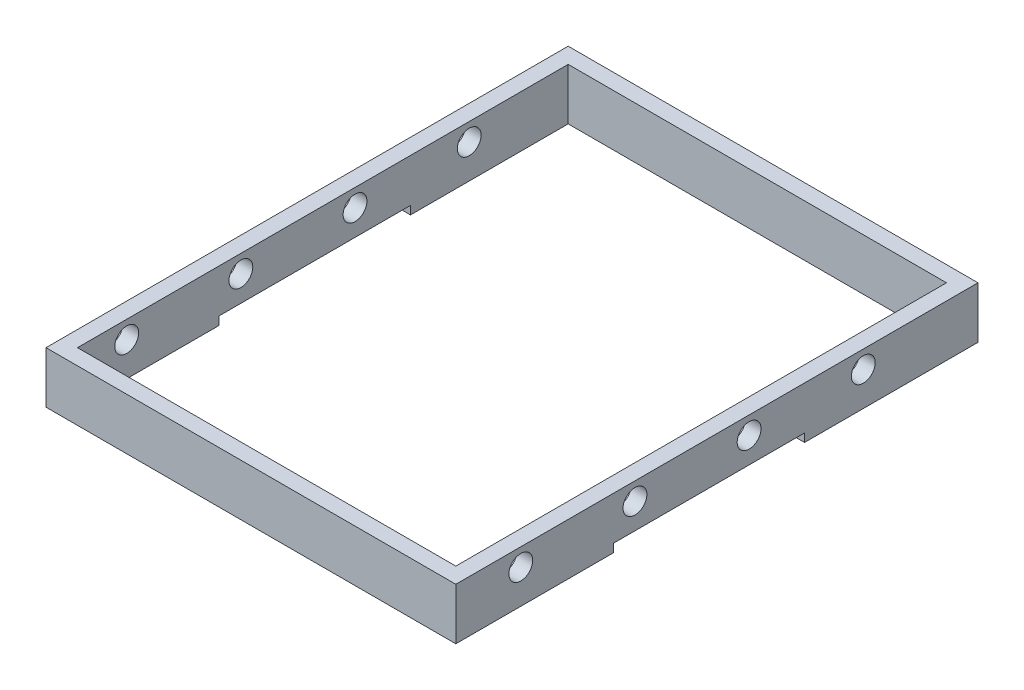
ISO-10303-21;
HEADER;
FILE_DESCRIPTION(('STEP AP214'),'2;1');
FILE_NAME('part.step','',(''),(''),'','','');
FILE_SCHEMA(('AUTOMOTIVE_DESIGN { 1 0 10303 214 1 1 1 1 }'));
ENDSEC;
DATA;
#1=APPLICATION_CONTEXT('core data for automotive mechanical design processes');
#2=APPLICATION_PROTOCOL_DEFINITION('international standard','automotive_design',2000,#1);
#3=PRODUCT_CONTEXT('',#1,'mechanical');
#4=PRODUCT('Part','Part','',(#3));
#5=PRODUCT_RELATED_PRODUCT_CATEGORY('part','',(#4));
#6=PRODUCT_DEFINITION_FORMATION('','',#4);
#7=PRODUCT_DEFINITION_CONTEXT('part definition',#1,'design');
#8=PRODUCT_DEFINITION('design','',#6,#7);
#9=PRODUCT_DEFINITION_SHAPE('','',#8);
#10=(LENGTH_UNIT() NAMED_UNIT(*) SI_UNIT(.MILLI.,.METRE.));
#11=(NAMED_UNIT(*) PLANE_ANGLE_UNIT() SI_UNIT($,.RADIAN.));
#12=(NAMED_UNIT(*) SI_UNIT($,.STERADIAN.) SOLID_ANGLE_UNIT());
#13=UNCERTAINTY_MEASURE_WITH_UNIT(LENGTH_MEASURE(1.E-05),#10,'distance_accuracy_value','');
#14=(GEOMETRIC_REPRESENTATION_CONTEXT(3) GLOBAL_UNCERTAINTY_ASSIGNED_CONTEXT((#13)) GLOBAL_UNIT_ASSIGNED_CONTEXT((#10,
#11,#12)) REPRESENTATION_CONTEXT('',''));
#15=CARTESIAN_POINT('',(0.,0.,0.));
#16=DIRECTION('',(0.,0.,1.));
#17=DIRECTION('',(1.,0.,0.));
#18=AXIS2_PLACEMENT_3D('',#15,#16,#17);
#19=CARTESIAN_POINT('',(0.,0.,0.));
#20=DIRECTION('',(0.,-1.,0.));
#21=DIRECTION('',(0.,0.,-1.));
#22=AXIS2_PLACEMENT_3D('',#19,#20,#21);
#23=PLANE('',#22);
#24=DIRECTION('',(0.,0.,1.));
#25=VECTOR('',#24,1.);
#26=CARTESIAN_POINT('',(-52.05,0.,66.32));
#27=LINE('',#26,#25);
#28=CARTESIAN_POINT('',(-52.05,0.,-22.26));
#29=VERTEX_POINT('',#28);
#30=CARTESIAN_POINT('',(-52.05,0.,26.32));
#31=VERTEX_POINT('',#30);
#32=EDGE_CURVE('E57',#29,#31,#27,.T.);
#33=ORIENTED_EDGE('',*,*,#32,.F.);
#34=DIRECTION('',(-1.,0.,0.));
#35=VECTOR('',#34,1.);
#36=CARTESIAN_POINT('',(-48.05,0.,-22.26));
#37=LINE('',#36,#35);
#38=CARTESIAN_POINT('',(-48.05,0.,-22.26));
#39=VERTEX_POINT('',#38);
#40=EDGE_CURVE('E532',#39,#29,#37,.T.);
#41=ORIENTED_EDGE('',*,*,#40,.F.);
#42=DIRECTION('',(0.,0.,1.));
#43=VECTOR('',#42,1.);
#44=CARTESIAN_POINT('',(-48.05,0.,62.32));
#45=LINE('',#44,#43);
#46=CARTESIAN_POINT('',(-48.05,0.,26.32));
#47=VERTEX_POINT('',#46);
#48=EDGE_CURVE('E173',#39,#47,#45,.T.);
#49=ORIENTED_EDGE('',*,*,#48,.T.);
#50=DIRECTION('',(1.,0.,0.));
#51=VECTOR('',#50,1.);
#52=CARTESIAN_POINT('',(-52.05,0.,26.32));
#53=LINE('',#52,#51);
#54=EDGE_CURVE('E177',#31,#47,#53,.T.);
#55=ORIENTED_EDGE('',*,*,#54,.F.);
#56=EDGE_LOOP('',(#33,#41,#49,#55));
#57=FACE_BOUND('',#56,.T.);
#58=ADVANCED_FACE('F34',(#57),#23,.T.);
#59=DIRECTION('',(0.,0.,-1.));
#60=VECTOR('',#59,1.);
#61=CARTESIAN_POINT('',(48.05,0.,62.32));
#62=LINE('',#61,#60);
#63=CARTESIAN_POINT('',(48.05,0.,26.32));
#64=VERTEX_POINT('',#63);
#65=CARTESIAN_POINT('',(48.05,0.,-22.26));
#66=VERTEX_POINT('',#65);
#67=EDGE_CURVE('E238',#64,#66,#62,.T.);
#68=ORIENTED_EDGE('',*,*,#67,.T.);
#69=DIRECTION('',(-1.,0.,0.));
#70=VECTOR('',#69,1.);
#71=CARTESIAN_POINT('',(52.05,0.,-22.26));
#72=LINE('',#71,#70);
#73=CARTESIAN_POINT('',(52.05,0.,-22.26));
#74=VERTEX_POINT('',#73);
#75=EDGE_CURVE('E49',#74,#66,#72,.T.);
#76=ORIENTED_EDGE('',*,*,#75,.F.);
#77=DIRECTION('',(0.,0.,-1.));
#78=VECTOR('',#77,1.);
#79=CARTESIAN_POINT('',(52.05,0.,66.32));
#80=LINE('',#79,#78);
#81=CARTESIAN_POINT('',(52.05,0.,26.32));
#82=VERTEX_POINT('',#81);
#83=EDGE_CURVE('E258',#82,#74,#80,.T.);
#84=ORIENTED_EDGE('',*,*,#83,.F.);
#85=DIRECTION('',(1.,0.,0.));
#86=VECTOR('',#85,1.);
#87=CARTESIAN_POINT('',(48.05,0.,26.32));
#88=LINE('',#87,#86);
#89=EDGE_CURVE('E174',#64,#82,#88,.T.);
#90=ORIENTED_EDGE('',*,*,#89,.F.);
#91=EDGE_LOOP('',(#68,#76,#84,#90));
#92=FACE_BOUND('',#91,.T.);
#93=ADVANCED_FACE('F320',(#92),#23,.T.);
#94=CARTESIAN_POINT('',(-52.05,6.5,-37.18));
#95=DIRECTION('',(1.,0.,0.));
#96=DIRECTION('',(0.,0.,-1.));
#97=AXIS2_PLACEMENT_3D('',#94,#95,#96);
#98=CYLINDRICAL_SURFACE('',#97,3.025);
#99=CARTESIAN_POINT('',(-48.05,6.5,-37.18));
#100=DIRECTION('',(1.,0.,0.));
#101=DIRECTION('',(0.,0.,-1.));
#102=AXIS2_PLACEMENT_3D('',#99,#100,#101);
#103=CIRCLE('',#102,3.025);
#104=CARTESIAN_POINT('',(-48.05,6.5,-40.205));
#105=VERTEX_POINT('',#104);
#106=EDGE_CURVE('E42',#105,#105,#103,.T.);
#107=ORIENTED_EDGE('',*,*,#106,.T.);
#108=EDGE_LOOP('',(#107));
#109=FACE_BOUND('',#108,.T.);
#110=CARTESIAN_POINT('',(-52.05,6.5,-37.18));
#111=DIRECTION('',(1.,0.,0.));
#112=DIRECTION('',(0.,0.,-1.));
#113=AXIS2_PLACEMENT_3D('',#110,#111,#112);
#114=CIRCLE('',#113,3.025);
#115=CARTESIAN_POINT('',(-52.05,6.5,-40.205));
#116=VERTEX_POINT('',#115);
#117=EDGE_CURVE('E11',#116,#116,#114,.T.);
#118=ORIENTED_EDGE('',*,*,#117,.F.);
#119=EDGE_LOOP('',(#118));
#120=FACE_BOUND('',#119,.T.);
#121=ADVANCED_FACE('F36',(#109,#120),#98,.F.);
#122=CARTESIAN_POINT('',(-52.05,6.5,-8.18));
#123=DIRECTION('',(1.,0.,0.));
#124=DIRECTION('',(0.,0.,-1.));
#125=AXIS2_PLACEMENT_3D('',#122,#123,#124);
#126=CYLINDRICAL_SURFACE('',#125,3.025);
#127=CARTESIAN_POINT('',(-48.05,6.5,-8.18));
#128=DIRECTION('',(1.,0.,0.));
#129=DIRECTION('',(0.,0.,-1.));
#130=AXIS2_PLACEMENT_3D('',#127,#128,#129);
#131=CIRCLE('',#130,3.025);
#132=CARTESIAN_POINT('',(-48.05,6.5,-11.205));
#133=VERTEX_POINT('',#132);
#134=EDGE_CURVE('E292',#133,#133,#131,.T.);
#135=ORIENTED_EDGE('',*,*,#134,.T.);
#136=EDGE_LOOP('',(#135));
#137=FACE_BOUND('',#136,.T.);
#138=CARTESIAN_POINT('',(-52.05,6.5,-8.18));
#139=DIRECTION('',(1.,0.,0.));
#140=DIRECTION('',(0.,0.,-1.));
#141=AXIS2_PLACEMENT_3D('',#138,#139,#140);
#142=CIRCLE('',#141,3.025);
#143=CARTESIAN_POINT('',(-52.05,6.5,-11.205));
#144=VERTEX_POINT('',#143);
#145=EDGE_CURVE('E295',#144,#144,#142,.T.);
#146=ORIENTED_EDGE('',*,*,#145,.F.);
#147=EDGE_LOOP('',(#146));
#148=FACE_BOUND('',#147,.T.);
#149=ADVANCED_FACE('F351',(#137,#148),#126,.F.);
#150=CARTESIAN_POINT('',(-52.05,6.5,-37.18));
#151=DIRECTION('',(1.,0.,0.));
#152=DIRECTION('',(0.,0.,-1.));
#153=AXIS2_PLACEMENT_3D('',#150,#151,#152);
#154=CYLINDRICAL_SURFACE('',#153,3.025);
#155=CARTESIAN_POINT('',(48.05,6.5,-37.18));
#156=DIRECTION('',(-1.,0.,0.));
#157=DIRECTION('',(0.,0.,1.));
#158=AXIS2_PLACEMENT_3D('',#155,#156,#157);
#159=CIRCLE('',#158,3.025);
#160=CARTESIAN_POINT('',(48.05,6.5,-34.155));
#161=VERTEX_POINT('',#160);
#162=EDGE_CURVE('E286',#161,#161,#159,.T.);
#163=ORIENTED_EDGE('',*,*,#162,.T.);
#164=EDGE_LOOP('',(#163));
#165=FACE_BOUND('',#164,.T.);
#166=CARTESIAN_POINT('',(52.05,6.5,-37.18));
#167=DIRECTION('',(1.,0.,0.));
#168=DIRECTION('',(0.,0.,-1.));
#169=AXIS2_PLACEMENT_3D('',#166,#167,#168);
#170=CIRCLE('',#169,3.025);
#171=CARTESIAN_POINT('',(52.05,6.5,-40.205));
#172=VERTEX_POINT('',#171);
#173=EDGE_CURVE('E289',#172,#172,#170,.T.);
#174=ORIENTED_EDGE('',*,*,#173,.T.);
#175=EDGE_LOOP('',(#174));
#176=FACE_BOUND('',#175,.T.);
#177=ADVANCED_FACE('F348',(#165,#176),#154,.F.);
#178=CARTESIAN_POINT('',(-52.05,6.5,-8.18));
#179=DIRECTION('',(1.,0.,0.));
#180=DIRECTION('',(0.,0.,-1.));
#181=AXIS2_PLACEMENT_3D('',#178,#179,#180);
#182=CYLINDRICAL_SURFACE('',#181,3.025);
#183=CARTESIAN_POINT('',(48.05,6.5,-8.18));
#184=DIRECTION('',(-1.,0.,0.));
#185=DIRECTION('',(0.,0.,1.));
#186=AXIS2_PLACEMENT_3D('',#183,#184,#185);
#187=CIRCLE('',#186,3.025);
#188=CARTESIAN_POINT('',(48.05,6.5,-5.155));
#189=VERTEX_POINT('',#188);
#190=EDGE_CURVE('E278',#189,#189,#187,.T.);
#191=ORIENTED_EDGE('',*,*,#190,.T.);
#192=EDGE_LOOP('',(#191));
#193=FACE_BOUND('',#192,.T.);
#194=CARTESIAN_POINT('',(52.05,6.5,-8.18));
#195=DIRECTION('',(1.,0.,0.));
#196=DIRECTION('',(0.,0.,-1.));
#197=AXIS2_PLACEMENT_3D('',#194,#195,#196);
#198=CIRCLE('',#197,3.025);
#199=CARTESIAN_POINT('',(52.05,6.5,-11.205));
#200=VERTEX_POINT('',#199);
#201=EDGE_CURVE('E283',#200,#200,#198,.T.);
#202=ORIENTED_EDGE('',*,*,#201,.T.);
#203=EDGE_LOOP('',(#202));
#204=FACE_BOUND('',#203,.T.);
#205=ADVANCED_FACE('F345',(#193,#204),#182,.F.);
#206=CARTESIAN_POINT('',(0.,11.,0.));
#207=DIRECTION('',(0.,-1.,0.));
#208=DIRECTION('',(0.,0.,-1.));
#209=AXIS2_PLACEMENT_3D('',#206,#207,#208);
#210=PLANE('',#209);
#211=DIRECTION('',(0.,0.,-1.));
#212=VECTOR('',#211,1.);
#213=CARTESIAN_POINT('',(52.05,11.,66.32));
#214=LINE('',#213,#212);
#215=CARTESIAN_POINT('',(52.05,11.,66.32));
#216=VERTEX_POINT('',#215);
#217=CARTESIAN_POINT('',(52.05,11.,-66.32));
#218=VERTEX_POINT('',#217);
#219=EDGE_CURVE('E259',#216,#218,#214,.T.);
#220=ORIENTED_EDGE('',*,*,#219,.T.);
#221=DIRECTION('',(-1.,0.,0.));
#222=VECTOR('',#221,1.);
#223=CARTESIAN_POINT('',(-52.05,11.,-66.32));
#224=LINE('',#223,#222);
#225=CARTESIAN_POINT('',(-52.05,11.,-66.32));
#226=VERTEX_POINT('',#225);
#227=EDGE_CURVE('E262',#218,#226,#224,.T.);
#228=ORIENTED_EDGE('',*,*,#227,.T.);
#229=DIRECTION('',(0.,0.,1.));
#230=VECTOR('',#229,1.);
#231=CARTESIAN_POINT('',(-52.05,11.,66.32));
#232=LINE('',#231,#230);
#233=CARTESIAN_POINT('',(-52.05,11.,66.32));
#234=VERTEX_POINT('',#233);
#235=EDGE_CURVE('E264',#226,#234,#232,.T.);
#236=ORIENTED_EDGE('',*,*,#235,.T.);
#237=DIRECTION('',(1.,0.,0.));
#238=VECTOR('',#237,1.);
#239=CARTESIAN_POINT('',(-52.05,11.,66.32));
#240=LINE('',#239,#238);
#241=EDGE_CURVE('E266',#234,#216,#240,.T.);
#242=ORIENTED_EDGE('',*,*,#241,.T.);
#243=EDGE_LOOP('',(#220,#228,#236,#242));
#244=FACE_BOUND('',#243,.T.);
#245=DIRECTION('',(0.,0.,-1.));
#246=VECTOR('',#245,1.);
#247=CARTESIAN_POINT('',(48.05,11.,62.32));
#248=LINE('',#247,#246);
#249=CARTESIAN_POINT('',(48.05,11.,62.32));
#250=VERTEX_POINT('',#249);
#251=CARTESIAN_POINT('',(48.05,11.,-62.32));
#252=VERTEX_POINT('',#251);
#253=EDGE_CURVE('E239',#250,#252,#248,.T.);
#254=ORIENTED_EDGE('',*,*,#253,.F.);
#255=DIRECTION('',(1.,0.,0.));
#256=VECTOR('',#255,1.);
#257=CARTESIAN_POINT('',(-48.05,11.,62.32));
#258=LINE('',#257,#256);
#259=CARTESIAN_POINT('',(-48.05,11.,62.32));
#260=VERTEX_POINT('',#259);
#261=EDGE_CURVE('E246',#260,#250,#258,.T.);
#262=ORIENTED_EDGE('',*,*,#261,.F.);
#263=DIRECTION('',(0.,0.,1.));
#264=VECTOR('',#263,1.);
#265=CARTESIAN_POINT('',(-48.05,11.,62.32));
#266=LINE('',#265,#264);
#267=CARTESIAN_POINT('',(-48.05,11.,-62.32));
#268=VERTEX_POINT('',#267);
#269=EDGE_CURVE('E243',#268,#260,#266,.T.);
#270=ORIENTED_EDGE('',*,*,#269,.F.);
#271=DIRECTION('',(-1.,0.,0.));
#272=VECTOR('',#271,1.);
#273=CARTESIAN_POINT('',(-48.05,11.,-62.32));
#274=LINE('',#273,#272);
#275=EDGE_CURVE('E241',#252,#268,#274,.T.);
#276=ORIENTED_EDGE('',*,*,#275,.F.);
#277=EDGE_LOOP('',(#254,#262,#270,#276));
#278=FACE_BOUND('',#277,.T.);
#279=ADVANCED_FACE('F327',(#244,#278),#210,.F.);
#280=CARTESIAN_POINT('',(52.05,11.,66.32));
#281=DIRECTION('',(-1.,0.,0.));
#282=DIRECTION('',(0.,0.,1.));
#283=AXIS2_PLACEMENT_3D('',#280,#281,#282);
#284=PLANE('',#283);
#285=CARTESIAN_POINT('',(52.05,6.5,20.82));
#286=DIRECTION('',(1.,0.,0.));
#287=DIRECTION('',(0.,0.,-1.));
#288=AXIS2_PLACEMENT_3D('',#285,#286,#287);
#289=CIRCLE('',#288,3.025);
#290=CARTESIAN_POINT('',(52.05,6.5,17.795));
#291=VERTEX_POINT('',#290);
#292=EDGE_CURVE('E225',#291,#291,#289,.T.);
#293=ORIENTED_EDGE('',*,*,#292,.F.);
#294=EDGE_LOOP('',(#293));
#295=FACE_BOUND('',#294,.T.);
#296=CARTESIAN_POINT('',(52.05,6.5,49.82));
#297=DIRECTION('',(1.,0.,0.));
#298=DIRECTION('',(0.,0.,-1.));
#299=AXIS2_PLACEMENT_3D('',#296,#297,#298);
#300=CIRCLE('',#299,3.025);
#301=CARTESIAN_POINT('',(52.05,6.5,46.795));
#302=VERTEX_POINT('',#301);
#303=EDGE_CURVE('E228',#302,#302,#300,.T.);
#304=ORIENTED_EDGE('',*,*,#303,.F.);
#305=EDGE_LOOP('',(#304));
#306=FACE_BOUND('',#305,.T.);
#307=DIRECTION('',(0.,-1.,0.));
#308=VECTOR('',#307,1.);
#309=CARTESIAN_POINT('',(52.05,11.,66.32));
#310=LINE('',#309,#308);
#311=CARTESIAN_POINT('',(52.05,-2.1,66.32));
#312=VERTEX_POINT('',#311);
#313=EDGE_CURVE('E268',#216,#312,#310,.T.);
#314=ORIENTED_EDGE('',*,*,#313,.T.);
#315=DIRECTION('',(0.,0.,1.));
#316=VECTOR('',#315,1.);
#317=CARTESIAN_POINT('',(52.05,-2.1,26.32));
#318=LINE('',#317,#316);
#319=CARTESIAN_POINT('',(52.05,-2.1,26.32));
#320=VERTEX_POINT('',#319);
#321=EDGE_CURVE('E190',#320,#312,#318,.T.);
#322=ORIENTED_EDGE('',*,*,#321,.F.);
#323=DIRECTION('',(0.,1.,0.));
#324=VECTOR('',#323,1.);
#325=CARTESIAN_POINT('',(52.05,-2.1,26.32));
#326=LINE('',#325,#324);
#327=EDGE_CURVE('E210',#320,#82,#326,.T.);
#328=ORIENTED_EDGE('',*,*,#327,.T.);
#329=ORIENTED_EDGE('',*,*,#83,.T.);
#330=DIRECTION('',(0.,1.,0.));
#331=VECTOR('',#330,1.);
#332=CARTESIAN_POINT('',(52.05,-2.1,-22.26));
#333=LINE('',#332,#331);
#334=CARTESIAN_POINT('',(52.05,-2.1,-22.26));
#335=VERTEX_POINT('',#334);
#336=EDGE_CURVE('E179',#335,#74,#333,.T.);
#337=ORIENTED_EDGE('',*,*,#336,.F.);
#338=DIRECTION('',(0.,0.,1.));
#339=VECTOR('',#338,1.);
#340=CARTESIAN_POINT('',(52.05,-2.1,-66.32));
#341=LINE('',#340,#339);
#342=CARTESIAN_POINT('',(52.05,-2.1,-66.32));
#343=VERTEX_POINT('',#342);
#344=EDGE_CURVE('E522',#343,#335,#341,.T.);
#345=ORIENTED_EDGE('',*,*,#344,.F.);
#346=DIRECTION('',(0.,-1.,0.));
#347=VECTOR('',#346,1.);
#348=CARTESIAN_POINT('',(52.05,11.,-66.32));
#349=LINE('',#348,#347);
#350=EDGE_CURVE('E276',#218,#343,#349,.T.);
#351=ORIENTED_EDGE('',*,*,#350,.F.);
#352=ORIENTED_EDGE('',*,*,#219,.F.);
#353=EDGE_LOOP('',(#314,#322,#328,#329,#337,#345,#351,#352));
#354=FACE_BOUND('',#353,.T.);
#355=ORIENTED_EDGE('',*,*,#201,.F.);
#356=EDGE_LOOP('',(#355));
#357=FACE_BOUND('',#356,.T.);
#358=ORIENTED_EDGE('',*,*,#173,.F.);
#359=EDGE_LOOP('',(#358));
#360=FACE_BOUND('',#359,.T.);
#361=ADVANCED_FACE('F340',(#295,#306,#354,#357,#360),#284,.F.);
#362=CARTESIAN_POINT('',(-52.05,11.,-66.32));
#363=DIRECTION('',(0.,0.,1.));
#364=DIRECTION('',(1.,0.,0.));
#365=AXIS2_PLACEMENT_3D('',#362,#363,#364);
#366=PLANE('',#365);
#367=ORIENTED_EDGE('',*,*,#350,.T.);
#368=DIRECTION('',(1.,0.,0.));
#369=VECTOR('',#368,1.);
#370=CARTESIAN_POINT('',(-52.05,-2.1,-66.32));
#371=LINE('',#370,#369);
#372=CARTESIAN_POINT('',(-52.05,-2.1,-66.32));
#373=VERTEX_POINT('',#372);
#374=EDGE_CURVE('E518',#373,#343,#371,.T.);
#375=ORIENTED_EDGE('',*,*,#374,.F.);
#376=DIRECTION('',(0.,-1.,0.));
#377=VECTOR('',#376,1.);
#378=CARTESIAN_POINT('',(-52.05,11.,-66.32));
#379=LINE('',#378,#377);
#380=EDGE_CURVE('E274',#226,#373,#379,.T.);
#381=ORIENTED_EDGE('',*,*,#380,.F.);
#382=ORIENTED_EDGE('',*,*,#227,.F.);
#383=EDGE_LOOP('',(#367,#375,#381,#382));
#384=FACE_BOUND('',#383,.T.);
#385=ADVANCED_FACE('F336',(#384),#366,.F.);
#386=CARTESIAN_POINT('',(-52.05,11.,66.32));
#387=DIRECTION('',(1.,0.,0.));
#388=DIRECTION('',(0.,0.,-1.));
#389=AXIS2_PLACEMENT_3D('',#386,#387,#388);
#390=PLANE('',#389);
#391=CARTESIAN_POINT('',(-52.05,6.5,20.82));
#392=DIRECTION('',(1.,0.,0.));
#393=DIRECTION('',(0.,0.,-1.));
#394=AXIS2_PLACEMENT_3D('',#391,#392,#393);
#395=CIRCLE('',#394,3.025);
#396=CARTESIAN_POINT('',(-52.05,6.5,17.795));
#397=VERTEX_POINT('',#396);
#398=EDGE_CURVE('E219',#397,#397,#395,.T.);
#399=ORIENTED_EDGE('',*,*,#398,.T.);
#400=EDGE_LOOP('',(#399));
#401=FACE_BOUND('',#400,.T.);
#402=CARTESIAN_POINT('',(-52.05,6.5,49.82));
#403=DIRECTION('',(1.,0.,0.));
#404=DIRECTION('',(0.,0.,-1.));
#405=AXIS2_PLACEMENT_3D('',#402,#403,#404);
#406=CIRCLE('',#405,3.025);
#407=CARTESIAN_POINT('',(-52.05,6.5,46.795));
#408=VERTEX_POINT('',#407);
#409=EDGE_CURVE('E229',#408,#408,#406,.T.);
#410=ORIENTED_EDGE('',*,*,#409,.T.);
#411=EDGE_LOOP('',(#410));
#412=FACE_BOUND('',#411,.T.);
#413=ORIENTED_EDGE('',*,*,#380,.T.);
#414=DIRECTION('',(0.,0.,-1.));
#415=VECTOR('',#414,1.);
#416=CARTESIAN_POINT('',(-52.05,-2.1,-22.26));
#417=LINE('',#416,#415);
#418=CARTESIAN_POINT('',(-52.05,-2.1,-22.26));
#419=VERTEX_POINT('',#418);
#420=EDGE_CURVE('E158',#419,#373,#417,.T.);
#421=ORIENTED_EDGE('',*,*,#420,.F.);
#422=DIRECTION('',(0.,1.,0.));
#423=VECTOR('',#422,1.);
#424=CARTESIAN_POINT('',(-52.05,-2.1,-22.26));
#425=LINE('',#424,#423);
#426=EDGE_CURVE('E154',#419,#29,#425,.T.);
#427=ORIENTED_EDGE('',*,*,#426,.T.);
#428=ORIENTED_EDGE('',*,*,#32,.T.);
#429=DIRECTION('',(0.,1.,0.));
#430=VECTOR('',#429,1.);
#431=CARTESIAN_POINT('',(-52.05,-2.1,26.32));
#432=LINE('',#431,#430);
#433=CARTESIAN_POINT('',(-52.05,-2.1,26.32));
#434=VERTEX_POINT('',#433);
#435=EDGE_CURVE('E207',#434,#31,#432,.T.);
#436=ORIENTED_EDGE('',*,*,#435,.F.);
#437=DIRECTION('',(0.,0.,-1.));
#438=VECTOR('',#437,1.);
#439=CARTESIAN_POINT('',(-52.05,-2.1,66.32));
#440=LINE('',#439,#438);
#441=CARTESIAN_POINT('',(-52.05,-2.1,66.32));
#442=VERTEX_POINT('',#441);
#443=EDGE_CURVE('E196',#442,#434,#440,.T.);
#444=ORIENTED_EDGE('',*,*,#443,.F.);
#445=DIRECTION('',(0.,-1.,0.));
#446=VECTOR('',#445,1.);
#447=CARTESIAN_POINT('',(-52.05,11.,66.32));
#448=LINE('',#447,#446);
#449=EDGE_CURVE('E272',#234,#442,#448,.T.);
#450=ORIENTED_EDGE('',*,*,#449,.F.);
#451=ORIENTED_EDGE('',*,*,#235,.F.);
#452=EDGE_LOOP('',(#413,#421,#427,#428,#436,#444,#450,#451));
#453=FACE_BOUND('',#452,.T.);
#454=ORIENTED_EDGE('',*,*,#145,.T.);
#455=EDGE_LOOP('',(#454));
#456=FACE_BOUND('',#455,.T.);
#457=ORIENTED_EDGE('',*,*,#117,.T.);
#458=EDGE_LOOP('',(#457));
#459=FACE_BOUND('',#458,.T.);
#460=ADVANCED_FACE('F332',(#401,#412,#453,#456,#459),#390,.F.);
#461=CARTESIAN_POINT('',(-52.05,11.,66.32));
#462=DIRECTION('',(0.,0.,-1.));
#463=DIRECTION('',(-1.,0.,0.));
#464=AXIS2_PLACEMENT_3D('',#461,#462,#463);
#465=PLANE('',#464);
#466=ORIENTED_EDGE('',*,*,#449,.T.);
#467=DIRECTION('',(-1.,0.,0.));
#468=VECTOR('',#467,1.);
#469=CARTESIAN_POINT('',(52.05,-2.1,66.32));
#470=LINE('',#469,#468);
#471=EDGE_CURVE('E193',#312,#442,#470,.T.);
#472=ORIENTED_EDGE('',*,*,#471,.F.);
#473=ORIENTED_EDGE('',*,*,#313,.F.);
#474=ORIENTED_EDGE('',*,*,#241,.F.);
#475=EDGE_LOOP('',(#466,#472,#473,#474));
#476=FACE_BOUND('',#475,.T.);
#477=ADVANCED_FACE('F329',(#476),#465,.F.);
#478=CARTESIAN_POINT('',(48.05,11.,62.32));
#479=DIRECTION('',(-1.,0.,0.));
#480=DIRECTION('',(0.,0.,1.));
#481=AXIS2_PLACEMENT_3D('',#478,#479,#480);
#482=PLANE('',#481);
#483=CARTESIAN_POINT('',(48.05,6.5,20.82));
#484=DIRECTION('',(-1.,0.,0.));
#485=DIRECTION('',(0.,0.,1.));
#486=AXIS2_PLACEMENT_3D('',#483,#484,#485);
#487=CIRCLE('',#486,3.025);
#488=CARTESIAN_POINT('',(48.05,6.5,23.845));
#489=VERTEX_POINT('',#488);
#490=EDGE_CURVE('E222',#489,#489,#487,.T.);
#491=ORIENTED_EDGE('',*,*,#490,.F.);
#492=EDGE_LOOP('',(#491));
#493=FACE_BOUND('',#492,.T.);
#494=CARTESIAN_POINT('',(48.05,6.5,49.82));
#495=DIRECTION('',(-1.,0.,0.));
#496=DIRECTION('',(0.,0.,1.));
#497=AXIS2_PLACEMENT_3D('',#494,#495,#496);
#498=CIRCLE('',#497,3.025);
#499=CARTESIAN_POINT('',(48.05,6.5,52.845));
#500=VERTEX_POINT('',#499);
#501=EDGE_CURVE('E235',#500,#500,#498,.T.);
#502=ORIENTED_EDGE('',*,*,#501,.F.);
#503=EDGE_LOOP('',(#502));
#504=FACE_BOUND('',#503,.T.);
#505=ORIENTED_EDGE('',*,*,#67,.F.);
#506=DIRECTION('',(0.,1.,0.));
#507=VECTOR('',#506,1.);
#508=CARTESIAN_POINT('',(48.05,-2.1,26.32));
#509=LINE('',#508,#507);
#510=CARTESIAN_POINT('',(48.05,-2.1,26.32));
#511=VERTEX_POINT('',#510);
#512=EDGE_CURVE('E213',#511,#64,#509,.T.);
#513=ORIENTED_EDGE('',*,*,#512,.F.);
#514=DIRECTION('',(0.,0.,-1.));
#515=VECTOR('',#514,1.);
#516=CARTESIAN_POINT('',(48.05,-2.1,62.32));
#517=LINE('',#516,#515);
#518=CARTESIAN_POINT('',(48.05,-2.1,62.32));
#519=VERTEX_POINT('',#518);
#520=EDGE_CURVE('E186',#519,#511,#517,.T.);
#521=ORIENTED_EDGE('',*,*,#520,.F.);
#522=DIRECTION('',(0.,-1.,0.));
#523=VECTOR('',#522,1.);
#524=CARTESIAN_POINT('',(48.05,11.,62.32));
#525=LINE('',#524,#523);
#526=EDGE_CURVE('E248',#250,#519,#525,.T.);
#527=ORIENTED_EDGE('',*,*,#526,.F.);
#528=ORIENTED_EDGE('',*,*,#253,.T.);
#529=DIRECTION('',(0.,-1.,0.));
#530=VECTOR('',#529,1.);
#531=CARTESIAN_POINT('',(48.05,11.,-62.32));
#532=LINE('',#531,#530);
#533=CARTESIAN_POINT('',(48.05,-2.1,-62.32));
#534=VERTEX_POINT('',#533);
#535=EDGE_CURVE('E256',#252,#534,#532,.T.);
#536=ORIENTED_EDGE('',*,*,#535,.T.);
#537=DIRECTION('',(0.,0.,-1.));
#538=VECTOR('',#537,1.);
#539=CARTESIAN_POINT('',(48.05,-2.1,-22.26));
#540=LINE('',#539,#538);
#541=CARTESIAN_POINT('',(48.05,-2.1,-22.26));
#542=VERTEX_POINT('',#541);
#543=EDGE_CURVE('E528',#542,#534,#540,.T.);
#544=ORIENTED_EDGE('',*,*,#543,.F.);
#545=DIRECTION('',(0.,1.,0.));
#546=VECTOR('',#545,1.);
#547=CARTESIAN_POINT('',(48.05,-2.1,-22.26));
#548=LINE('',#547,#546);
#549=EDGE_CURVE('E531',#542,#66,#548,.T.);
#550=ORIENTED_EDGE('',*,*,#549,.T.);
#551=EDGE_LOOP('',(#505,#513,#521,#527,#528,#536,#544,#550));
#552=FACE_BOUND('',#551,.T.);
#553=ORIENTED_EDGE('',*,*,#190,.F.);
#554=EDGE_LOOP('',(#553));
#555=FACE_BOUND('',#554,.T.);
#556=ORIENTED_EDGE('',*,*,#162,.F.);
#557=EDGE_LOOP('',(#556));
#558=FACE_BOUND('',#557,.T.);
#559=ADVANCED_FACE('F314',(#493,#504,#552,#555,#558),#482,.T.);
#560=CARTESIAN_POINT('',(-48.05,11.,-62.32));
#561=DIRECTION('',(0.,0.,1.));
#562=DIRECTION('',(1.,0.,0.));
#563=AXIS2_PLACEMENT_3D('',#560,#561,#562);
#564=PLANE('',#563);
#565=DIRECTION('',(0.,-1.,0.));
#566=VECTOR('',#565,1.);
#567=CARTESIAN_POINT('',(-48.05,11.,-62.32));
#568=LINE('',#567,#566);
#569=CARTESIAN_POINT('',(-48.05,-2.1,-62.32));
#570=VERTEX_POINT('',#569);
#571=EDGE_CURVE('E254',#268,#570,#568,.T.);
#572=ORIENTED_EDGE('',*,*,#571,.T.);
#573=DIRECTION('',(-1.,0.,0.));
#574=VECTOR('',#573,1.);
#575=CARTESIAN_POINT('',(48.05,-2.1,-62.32));
#576=LINE('',#575,#574);
#577=EDGE_CURVE('E166',#534,#570,#576,.T.);
#578=ORIENTED_EDGE('',*,*,#577,.F.);
#579=ORIENTED_EDGE('',*,*,#535,.F.);
#580=ORIENTED_EDGE('',*,*,#275,.T.);
#581=EDGE_LOOP('',(#572,#578,#579,#580));
#582=FACE_BOUND('',#581,.T.);
#583=ADVANCED_FACE('F304',(#582),#564,.T.);
#584=CARTESIAN_POINT('',(-48.05,11.,62.32));
#585=DIRECTION('',(1.,0.,0.));
#586=DIRECTION('',(0.,0.,-1.));
#587=AXIS2_PLACEMENT_3D('',#584,#585,#586);
#588=PLANE('',#587);
#589=CARTESIAN_POINT('',(-48.05,6.5,20.82));
#590=DIRECTION('',(1.,0.,0.));
#591=DIRECTION('',(0.,0.,-1.));
#592=AXIS2_PLACEMENT_3D('',#589,#590,#591);
#593=CIRCLE('',#592,3.025);
#594=CARTESIAN_POINT('',(-48.05,6.5,17.795));
#595=VERTEX_POINT('',#594);
#596=EDGE_CURVE('E216',#595,#595,#593,.T.);
#597=ORIENTED_EDGE('',*,*,#596,.F.);
#598=EDGE_LOOP('',(#597));
#599=FACE_BOUND('',#598,.T.);
#600=CARTESIAN_POINT('',(-48.05,6.5,49.82));
#601=DIRECTION('',(1.,0.,0.));
#602=DIRECTION('',(0.,0.,-1.));
#603=AXIS2_PLACEMENT_3D('',#600,#601,#602);
#604=CIRCLE('',#603,3.025);
#605=CARTESIAN_POINT('',(-48.05,6.5,46.795));
#606=VERTEX_POINT('',#605);
#607=EDGE_CURVE('E232',#606,#606,#604,.T.);
#608=ORIENTED_EDGE('',*,*,#607,.F.);
#609=EDGE_LOOP('',(#608));
#610=FACE_BOUND('',#609,.T.);
#611=ORIENTED_EDGE('',*,*,#48,.F.);
#612=DIRECTION('',(0.,1.,0.));
#613=VECTOR('',#612,1.);
#614=CARTESIAN_POINT('',(-48.05,-2.1,-22.26));
#615=LINE('',#614,#613);
#616=CARTESIAN_POINT('',(-48.05,-2.1,-22.26));
#617=VERTEX_POINT('',#616);
#618=EDGE_CURVE('E152',#617,#39,#615,.T.);
#619=ORIENTED_EDGE('',*,*,#618,.F.);
#620=DIRECTION('',(0.,0.,1.));
#621=VECTOR('',#620,1.);
#622=CARTESIAN_POINT('',(-48.05,-2.1,-62.32));
#623=LINE('',#622,#621);
#624=EDGE_CURVE('E159',#570,#617,#623,.T.);
#625=ORIENTED_EDGE('',*,*,#624,.F.);
#626=ORIENTED_EDGE('',*,*,#571,.F.);
#627=ORIENTED_EDGE('',*,*,#269,.T.);
#628=DIRECTION('',(0.,-1.,0.));
#629=VECTOR('',#628,1.);
#630=CARTESIAN_POINT('',(-48.05,11.,62.32));
#631=LINE('',#630,#629);
#632=CARTESIAN_POINT('',(-48.05,-2.1,62.32));
#633=VERTEX_POINT('',#632);
#634=EDGE_CURVE('E252',#260,#633,#631,.T.);
#635=ORIENTED_EDGE('',*,*,#634,.T.);
#636=DIRECTION('',(0.,0.,1.));
#637=VECTOR('',#636,1.);
#638=CARTESIAN_POINT('',(-48.05,-2.1,26.32));
#639=LINE('',#638,#637);
#640=CARTESIAN_POINT('',(-48.05,-2.1,26.32));
#641=VERTEX_POINT('',#640);
#642=EDGE_CURVE('E200',#641,#633,#639,.T.);
#643=ORIENTED_EDGE('',*,*,#642,.F.);
#644=DIRECTION('',(0.,1.,0.));
#645=VECTOR('',#644,1.);
#646=CARTESIAN_POINT('',(-48.05,-2.1,26.32));
#647=LINE('',#646,#645);
#648=EDGE_CURVE('E202',#641,#47,#647,.T.);
#649=ORIENTED_EDGE('',*,*,#648,.T.);
#650=EDGE_LOOP('',(#611,#619,#625,#626,#627,#635,#643,#649));
#651=FACE_BOUND('',#650,.T.);
#652=ORIENTED_EDGE('',*,*,#134,.F.);
#653=EDGE_LOOP('',(#652));
#654=FACE_BOUND('',#653,.T.);
#655=ORIENTED_EDGE('',*,*,#106,.F.);
#656=EDGE_LOOP('',(#655));
#657=FACE_BOUND('',#656,.T.);
#658=ADVANCED_FACE('F170',(#599,#610,#651,#654,#657),#588,.T.);
#659=CARTESIAN_POINT('',(-48.05,11.,62.32));
#660=DIRECTION('',(0.,0.,-1.));
#661=DIRECTION('',(-1.,0.,0.));
#662=AXIS2_PLACEMENT_3D('',#659,#660,#661);
#663=PLANE('',#662);
#664=ORIENTED_EDGE('',*,*,#526,.T.);
#665=DIRECTION('',(1.,0.,0.));
#666=VECTOR('',#665,1.);
#667=CARTESIAN_POINT('',(-48.05,-2.1,62.32));
#668=LINE('',#667,#666);
#669=EDGE_CURVE('E183',#633,#519,#668,.T.);
#670=ORIENTED_EDGE('',*,*,#669,.F.);
#671=ORIENTED_EDGE('',*,*,#634,.F.);
#672=ORIENTED_EDGE('',*,*,#261,.T.);
#673=EDGE_LOOP('',(#664,#670,#671,#672));
#674=FACE_BOUND('',#673,.T.);
#675=ADVANCED_FACE('F303',(#674),#663,.T.);
#676=CARTESIAN_POINT('',(-52.05,6.5,49.82));
#677=DIRECTION('',(1.,0.,0.));
#678=DIRECTION('',(0.,0.,-1.));
#679=AXIS2_PLACEMENT_3D('',#676,#677,#678);
#680=CYLINDRICAL_SURFACE('',#679,3.025);
#681=ORIENTED_EDGE('',*,*,#607,.T.);
#682=EDGE_LOOP('',(#681));
#683=FACE_BOUND('',#682,.T.);
#684=ORIENTED_EDGE('',*,*,#409,.F.);
#685=EDGE_LOOP('',(#684));
#686=FACE_BOUND('',#685,.T.);
#687=ADVANCED_FACE('F311',(#683,#686),#680,.F.);
#688=ORIENTED_EDGE('',*,*,#501,.T.);
#689=EDGE_LOOP('',(#688));
#690=FACE_BOUND('',#689,.T.);
#691=ORIENTED_EDGE('',*,*,#303,.T.);
#692=EDGE_LOOP('',(#691));
#693=FACE_BOUND('',#692,.T.);
#694=ADVANCED_FACE('F501',(#690,#693),#680,.F.);
#695=CARTESIAN_POINT('',(-52.05,6.5,20.82));
#696=DIRECTION('',(1.,0.,0.));
#697=DIRECTION('',(0.,0.,-1.));
#698=AXIS2_PLACEMENT_3D('',#695,#696,#697);
#699=CYLINDRICAL_SURFACE('',#698,3.025);
#700=ORIENTED_EDGE('',*,*,#490,.T.);
#701=EDGE_LOOP('',(#700));
#702=FACE_BOUND('',#701,.T.);
#703=ORIENTED_EDGE('',*,*,#292,.T.);
#704=EDGE_LOOP('',(#703));
#705=FACE_BOUND('',#704,.T.);
#706=ADVANCED_FACE('F497',(#702,#705),#699,.F.);
#707=CARTESIAN_POINT('',(-52.05,6.5,20.82));
#708=DIRECTION('',(1.,0.,0.));
#709=DIRECTION('',(0.,0.,-1.));
#710=AXIS2_PLACEMENT_3D('',#707,#708,#709);
#711=CYLINDRICAL_SURFACE('',#710,3.025);
#712=ORIENTED_EDGE('',*,*,#596,.T.);
#713=EDGE_LOOP('',(#712));
#714=FACE_BOUND('',#713,.T.);
#715=ORIENTED_EDGE('',*,*,#398,.F.);
#716=EDGE_LOOP('',(#715));
#717=FACE_BOUND('',#716,.T.);
#718=ADVANCED_FACE('F444',(#714,#717),#711,.F.);
#719=CARTESIAN_POINT('',(48.05,-2.1,26.32));
#720=DIRECTION('',(0.,0.,1.));
#721=DIRECTION('',(1.,0.,0.));
#722=AXIS2_PLACEMENT_3D('',#719,#720,#721);
#723=PLANE('',#722);
#724=ORIENTED_EDGE('',*,*,#89,.T.);
#725=ORIENTED_EDGE('',*,*,#327,.F.);
#726=DIRECTION('',(1.,0.,0.));
#727=VECTOR('',#726,1.);
#728=CARTESIAN_POINT('',(48.05,-2.1,26.32));
#729=LINE('',#728,#727);
#730=EDGE_CURVE('E188',#511,#320,#729,.T.);
#731=ORIENTED_EDGE('',*,*,#730,.F.);
#732=ORIENTED_EDGE('',*,*,#512,.T.);
#733=EDGE_LOOP('',(#724,#725,#731,#732));
#734=FACE_BOUND('',#733,.T.);
#735=ADVANCED_FACE('F439',(#734),#723,.F.);
#736=CARTESIAN_POINT('',(-52.05,-2.1,26.32));
#737=DIRECTION('',(0.,0.,1.));
#738=DIRECTION('',(1.,0.,0.));
#739=AXIS2_PLACEMENT_3D('',#736,#737,#738);
#740=PLANE('',#739);
#741=ORIENTED_EDGE('',*,*,#54,.T.);
#742=ORIENTED_EDGE('',*,*,#648,.F.);
#743=DIRECTION('',(1.,0.,0.));
#744=VECTOR('',#743,1.);
#745=CARTESIAN_POINT('',(-52.05,-2.1,26.32));
#746=LINE('',#745,#744);
#747=EDGE_CURVE('E198',#434,#641,#746,.T.);
#748=ORIENTED_EDGE('',*,*,#747,.F.);
#749=ORIENTED_EDGE('',*,*,#435,.T.);
#750=EDGE_LOOP('',(#741,#742,#748,#749));
#751=FACE_BOUND('',#750,.T.);
#752=ADVANCED_FACE('F443',(#751),#740,.F.);
#753=CARTESIAN_POINT('',(0.,-2.1,0.));
#754=DIRECTION('',(0.,1.,0.));
#755=DIRECTION('',(0.,0.,1.));
#756=AXIS2_PLACEMENT_3D('',#753,#754,#755);
#757=PLANE('',#756);
#758=ORIENTED_EDGE('',*,*,#669,.T.);
#759=ORIENTED_EDGE('',*,*,#520,.T.);
#760=ORIENTED_EDGE('',*,*,#730,.T.);
#761=ORIENTED_EDGE('',*,*,#321,.T.);
#762=ORIENTED_EDGE('',*,*,#471,.T.);
#763=ORIENTED_EDGE('',*,*,#443,.T.);
#764=ORIENTED_EDGE('',*,*,#747,.T.);
#765=ORIENTED_EDGE('',*,*,#642,.T.);
#766=EDGE_LOOP('',(#758,#759,#760,#761,#762,#763,#764,#765));
#767=FACE_BOUND('',#766,.T.);
#768=ADVANCED_FACE('F455',(#767),#757,.F.);
#769=CARTESIAN_POINT('',(-48.05,-2.1,-22.26));
#770=DIRECTION('',(0.,0.,-1.));
#771=DIRECTION('',(-1.,0.,0.));
#772=AXIS2_PLACEMENT_3D('',#769,#770,#771);
#773=PLANE('',#772);
#774=ORIENTED_EDGE('',*,*,#40,.T.);
#775=ORIENTED_EDGE('',*,*,#426,.F.);
#776=DIRECTION('',(-1.,0.,0.));
#777=VECTOR('',#776,1.);
#778=CARTESIAN_POINT('',(-48.05,-2.1,-22.26));
#779=LINE('',#778,#777);
#780=EDGE_CURVE('E148',#617,#419,#779,.T.);
#781=ORIENTED_EDGE('',*,*,#780,.F.);
#782=ORIENTED_EDGE('',*,*,#618,.T.);
#783=EDGE_LOOP('',(#774,#775,#781,#782));
#784=FACE_BOUND('',#783,.T.);
#785=ADVANCED_FACE('F150',(#784),#773,.F.);
#786=CARTESIAN_POINT('',(52.05,-2.1,-22.26));
#787=DIRECTION('',(0.,0.,-1.));
#788=DIRECTION('',(-1.,0.,0.));
#789=AXIS2_PLACEMENT_3D('',#786,#787,#788);
#790=PLANE('',#789);
#791=ORIENTED_EDGE('',*,*,#75,.T.);
#792=ORIENTED_EDGE('',*,*,#549,.F.);
#793=DIRECTION('',(-1.,0.,0.));
#794=VECTOR('',#793,1.);
#795=CARTESIAN_POINT('',(52.05,-2.1,-22.26));
#796=LINE('',#795,#794);
#797=EDGE_CURVE('E524',#335,#542,#796,.T.);
#798=ORIENTED_EDGE('',*,*,#797,.F.);
#799=ORIENTED_EDGE('',*,*,#336,.T.);
#800=EDGE_LOOP('',(#791,#792,#798,#799));
#801=FACE_BOUND('',#800,.T.);
#802=ADVANCED_FACE('F474',(#801),#790,.F.);
#803=CARTESIAN_POINT('',(0.,-2.1,0.));
#804=DIRECTION('',(0.,-1.,0.));
#805=DIRECTION('',(0.,0.,-1.));
#806=AXIS2_PLACEMENT_3D('',#803,#804,#805);
#807=PLANE('',#806);
#808=ORIENTED_EDGE('',*,*,#624,.T.);
#809=ORIENTED_EDGE('',*,*,#780,.T.);
#810=ORIENTED_EDGE('',*,*,#420,.T.);
#811=ORIENTED_EDGE('',*,*,#374,.T.);
#812=ORIENTED_EDGE('',*,*,#344,.T.);
#813=ORIENTED_EDGE('',*,*,#797,.T.);
#814=ORIENTED_EDGE('',*,*,#543,.T.);
#815=ORIENTED_EDGE('',*,*,#577,.T.);
#816=EDGE_LOOP('',(#808,#809,#810,#811,#812,#813,#814,#815));
#817=FACE_BOUND('',#816,.T.);
#818=ADVANCED_FACE('F163',(#817),#807,.T.);
#819=CLOSED_SHELL('',(#58,#93,#121,#149,#177,#205,#279,#361,#385,#460,#477,#559,#583,#658,#675,
#687,#694,#706,#718,#735,#752,#768,#785,#802,#818));
#820=MANIFOLD_SOLID_BREP('B2',#819);
#821=ADVANCED_BREP_SHAPE_REPRESENTATION('',(#18,#820),#14);
#822=SHAPE_DEFINITION_REPRESENTATION(#9,#821);
ENDSEC;
END-ISO-10303-21;
